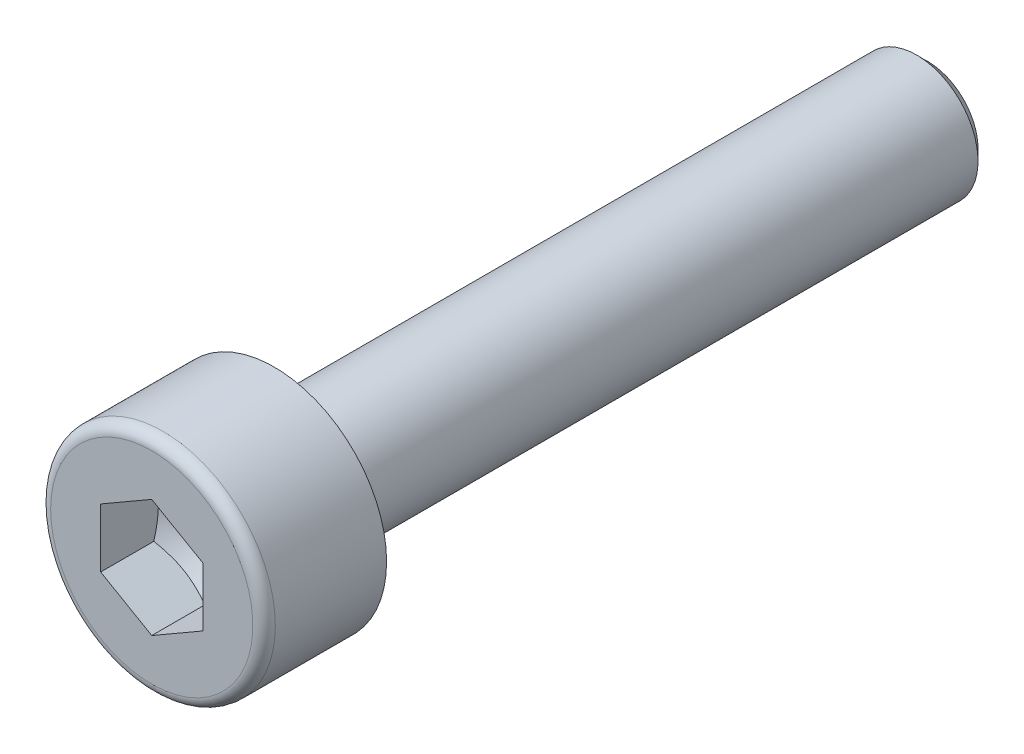
ISO-10303-21;
HEADER;
FILE_DESCRIPTION(('STEP AP214'),'2;1');
FILE_NAME('part.step','',(''),(''),'','','');
FILE_SCHEMA(('AUTOMOTIVE_DESIGN { 1 0 10303 214 1 1 1 1 }'));
ENDSEC;
DATA;
#1=APPLICATION_CONTEXT('core data for automotive mechanical design processes');
#2=APPLICATION_PROTOCOL_DEFINITION('international standard','automotive_design',2000,#1);
#3=PRODUCT_CONTEXT('',#1,'mechanical');
#4=PRODUCT('Part','Part','',(#3));
#5=PRODUCT_RELATED_PRODUCT_CATEGORY('part','',(#4));
#6=PRODUCT_DEFINITION_FORMATION('','',#4);
#7=PRODUCT_DEFINITION_CONTEXT('part definition',#1,'design');
#8=PRODUCT_DEFINITION('design','',#6,#7);
#9=PRODUCT_DEFINITION_SHAPE('','',#8);
#10=(LENGTH_UNIT() NAMED_UNIT(*) SI_UNIT(.MILLI.,.METRE.));
#11=(NAMED_UNIT(*) PLANE_ANGLE_UNIT() SI_UNIT($,.RADIAN.));
#12=(NAMED_UNIT(*) SI_UNIT($,.STERADIAN.) SOLID_ANGLE_UNIT());
#13=UNCERTAINTY_MEASURE_WITH_UNIT(LENGTH_MEASURE(1.E-05),#10,'distance_accuracy_value','');
#14=(GEOMETRIC_REPRESENTATION_CONTEXT(3) GLOBAL_UNCERTAINTY_ASSIGNED_CONTEXT((#13)) GLOBAL_UNIT_ASSIGNED_CONTEXT((#10,
#11,#12)) REPRESENTATION_CONTEXT('',''));
#15=CARTESIAN_POINT('',(0.,0.,0.));
#16=DIRECTION('',(0.,0.,1.));
#17=DIRECTION('',(1.,0.,0.));
#18=AXIS2_PLACEMENT_3D('',#15,#16,#17);
#19=CARTESIAN_POINT('',(-1.375,0.,0.));
#20=DIRECTION('',(0.,0.,-1.));
#21=DIRECTION('',(-1.,0.,0.));
#22=AXIS2_PLACEMENT_3D('',#19,#20,#21);
#23=PLANE('',#22);
#24=CARTESIAN_POINT('',(0.,0.,0.));
#25=DIRECTION('',(0.,0.,-1.));
#26=DIRECTION('',(-1.,0.,0.));
#27=AXIS2_PLACEMENT_3D('',#24,#25,#26);
#28=CIRCLE('',#27,2.75);
#29=CARTESIAN_POINT('',(-2.75,0.,0.));
#30=VERTEX_POINT('',#29);
#31=EDGE_CURVE('E10',#30,#30,#28,.T.);
#32=ORIENTED_EDGE('',*,*,#31,.T.);
#33=EDGE_LOOP('',(#32));
#34=FACE_BOUND('',#33,.T.);
#35=CARTESIAN_POINT('',(0.,0.,0.));
#36=DIRECTION('',(0.,0.,1.));
#37=DIRECTION('',(-1.,0.,0.));
#38=AXIS2_PLACEMENT_3D('',#35,#36,#37);
#39=CIRCLE('',#38,1.5);
#40=CARTESIAN_POINT('',(1.5,0.,0.));
#41=VERTEX_POINT('',#40);
#42=EDGE_CURVE('E125',#41,#41,#39,.T.);
#43=ORIENTED_EDGE('',*,*,#42,.T.);
#44=EDGE_LOOP('',(#43));
#45=FACE_BOUND('',#44,.T.);
#46=ADVANCED_FACE('F15',(#34,#45),#23,.T.);
#47=CARTESIAN_POINT('',(0.,0.,1.3625));
#48=DIRECTION('',(0.,0.,1.));
#49=DIRECTION('',(-1.,0.,0.));
#50=AXIS2_PLACEMENT_3D('',#47,#48,#49);
#51=CYLINDRICAL_SURFACE('',#50,2.75);
#52=CARTESIAN_POINT('',(0.,0.,2.725));
#53=DIRECTION('',(0.,0.,-1.));
#54=DIRECTION('',(-1.,0.,0.));
#55=AXIS2_PLACEMENT_3D('',#52,#53,#54);
#56=CIRCLE('',#55,2.75);
#57=CARTESIAN_POINT('',(-2.75,0.,2.725));
#58=VERTEX_POINT('',#57);
#59=EDGE_CURVE('E24',#58,#58,#56,.T.);
#60=ORIENTED_EDGE('',*,*,#59,.T.);
#61=EDGE_LOOP('',(#60));
#62=FACE_BOUND('',#61,.T.);
#63=ORIENTED_EDGE('',*,*,#31,.F.);
#64=EDGE_LOOP('',(#63));
#65=FACE_BOUND('',#64,.T.);
#66=ADVANCED_FACE('F181',(#62,#65),#51,.T.);
#67=CARTESIAN_POINT('',(0.,0.,2.725));
#68=DIRECTION('',(0.,0.,-1.));
#69=DIRECTION('',(0.,-1.,0.));
#70=AXIS2_PLACEMENT_3D('',#67,#68,#69);
#71=TOROIDAL_SURFACE('',#70,2.475,0.275);
#72=CARTESIAN_POINT('',(0.,0.,3.));
#73=DIRECTION('',(0.,0.,-1.));
#74=DIRECTION('',(-1.,0.,0.));
#75=AXIS2_PLACEMENT_3D('',#72,#73,#74);
#76=CIRCLE('',#75,2.475);
#77=CARTESIAN_POINT('',(-2.475,0.,3.));
#78=VERTEX_POINT('',#77);
#79=EDGE_CURVE('E130',#78,#78,#76,.T.);
#80=ORIENTED_EDGE('',*,*,#79,.T.);
#81=EDGE_LOOP('',(#80));
#82=FACE_BOUND('',#81,.T.);
#83=ORIENTED_EDGE('',*,*,#59,.F.);
#84=EDGE_LOOP('',(#83));
#85=FACE_BOUND('',#84,.T.);
#86=ADVANCED_FACE('F184',(#82,#85),#71,.T.);
#87=CARTESIAN_POINT('',(-1.2375,0.,3.));
#88=DIRECTION('',(0.,0.,1.));
#89=DIRECTION('',(1.,0.,0.));
#90=AXIS2_PLACEMENT_3D('',#87,#88,#89);
#91=PLANE('',#90);
#92=ORIENTED_EDGE('',*,*,#79,.F.);
#93=EDGE_LOOP('',(#92));
#94=FACE_BOUND('',#93,.T.);
#95=DIRECTION('',(-0.866025403784439,-0.5,0.));
#96=VECTOR('',#95,1.);
#97=CARTESIAN_POINT('',(0.160937208593682,-1.35045785929581,3.));
#98=LINE('',#97,#96);
#99=CARTESIAN_POINT('',(1.24999941718736,-0.7216875,3.));
#100=VERTEX_POINT('',#99);
#101=CARTESIAN_POINT('',(0.,-1.443375,3.));
#102=VERTEX_POINT('',#101);
#103=EDGE_CURVE('E116',#100,#102,#98,.T.);
#104=ORIENTED_EDGE('',*,*,#103,.T.);
#105=DIRECTION('',(-0.866025403784439,0.5,0.));
#106=VECTOR('',#105,1.);
#107=CARTESIAN_POINT('',(-1.08906220859368,-0.81460464070419,3.));
#108=LINE('',#107,#106);
#109=CARTESIAN_POINT('',(-1.24999941718736,-0.7216875,3.));
#110=VERTEX_POINT('',#109);
#111=EDGE_CURVE('E133',#102,#110,#108,.T.);
#112=ORIENTED_EDGE('',*,*,#111,.T.);
#113=DIRECTION('',(0.,1.,0.));
#114=VECTOR('',#113,1.);
#115=CARTESIAN_POINT('',(-1.24999941718736,0.,3.));
#116=LINE('',#115,#114);
#117=CARTESIAN_POINT('',(-1.24999941718736,0.7216875,3.));
#118=VERTEX_POINT('',#117);
#119=EDGE_CURVE('E18',#110,#118,#116,.T.);
#120=ORIENTED_EDGE('',*,*,#119,.T.);
#121=DIRECTION('',(0.866025403784439,0.5,0.));
#122=VECTOR('',#121,1.);
#123=CARTESIAN_POINT('',(-1.08906220859368,0.81460464070419,3.));
#124=LINE('',#123,#122);
#125=CARTESIAN_POINT('',(0.,1.443375,3.));
#126=VERTEX_POINT('',#125);
#127=EDGE_CURVE('E82',#118,#126,#124,.T.);
#128=ORIENTED_EDGE('',*,*,#127,.T.);
#129=DIRECTION('',(0.866025403784439,-0.5,0.));
#130=VECTOR('',#129,1.);
#131=CARTESIAN_POINT('',(0.160937208593682,1.35045785929581,3.));
#132=LINE('',#131,#130);
#133=CARTESIAN_POINT('',(1.24999941718736,0.7216875,3.));
#134=VERTEX_POINT('',#133);
#135=EDGE_CURVE('E147',#126,#134,#132,.T.);
#136=ORIENTED_EDGE('',*,*,#135,.T.);
#137=DIRECTION('',(0.,-1.,0.));
#138=VECTOR('',#137,1.);
#139=CARTESIAN_POINT('',(1.24999941718736,0.,3.));
#140=LINE('',#139,#138);
#141=EDGE_CURVE('E124',#134,#100,#140,.T.);
#142=ORIENTED_EDGE('',*,*,#141,.T.);
#143=EDGE_LOOP('',(#104,#112,#120,#128,#136,#142));
#144=FACE_BOUND('',#143,.T.);
#145=ADVANCED_FACE('F186',(#94,#144),#91,.T.);
#146=CARTESIAN_POINT('',(-0.6146875,0.,-16.));
#147=DIRECTION('',(0.,0.,-1.));
#148=DIRECTION('',(-1.,0.,0.));
#149=AXIS2_PLACEMENT_3D('',#146,#147,#148);
#150=PLANE('',#149);
#151=CARTESIAN_POINT('',(0.,0.,-16.));
#152=DIRECTION('',(0.,0.,-1.));
#153=DIRECTION('',(-1.,0.,0.));
#154=AXIS2_PLACEMENT_3D('',#151,#152,#153);
#155=CIRCLE('',#154,1.229375);
#156=CARTESIAN_POINT('',(-1.229375,0.,-16.));
#157=VERTEX_POINT('',#156);
#158=EDGE_CURVE('E126',#157,#157,#155,.T.);
#159=ORIENTED_EDGE('',*,*,#158,.T.);
#160=EDGE_LOOP('',(#159));
#161=FACE_BOUND('',#160,.T.);
#162=ADVANCED_FACE('F194',(#161),#150,.T.);
#163=CARTESIAN_POINT('',(0.,0.,-15.8646875));
#164=DIRECTION('',(0.,0.,1.));
#165=DIRECTION('',(-1.,0.,0.));
#166=AXIS2_PLACEMENT_3D('',#163,#164,#165);
#167=CONICAL_SURFACE('',#166,1.3646875,0.78539816339745);
#168=CARTESIAN_POINT('',(0.,0.,-15.729375));
#169=DIRECTION('',(0.,0.,-1.));
#170=DIRECTION('',(-1.,0.,0.));
#171=AXIS2_PLACEMENT_3D('',#168,#169,#170);
#172=CIRCLE('',#171,1.5);
#173=CARTESIAN_POINT('',(-1.5,0.,-15.729375));
#174=VERTEX_POINT('',#173);
#175=EDGE_CURVE('E127',#174,#174,#172,.T.);
#176=ORIENTED_EDGE('',*,*,#175,.T.);
#177=EDGE_LOOP('',(#176));
#178=FACE_BOUND('',#177,.T.);
#179=ORIENTED_EDGE('',*,*,#158,.F.);
#180=EDGE_LOOP('',(#179));
#181=FACE_BOUND('',#180,.T.);
#182=ADVANCED_FACE('F231',(#178,#181),#167,.T.);
#183=CARTESIAN_POINT('',(0.,0.,-7.3646875));
#184=DIRECTION('',(0.,0.,1.));
#185=DIRECTION('',(-1.,0.,0.));
#186=AXIS2_PLACEMENT_3D('',#183,#184,#185);
#187=CYLINDRICAL_SURFACE('',#186,1.5);
#188=ORIENTED_EDGE('',*,*,#42,.F.);
#189=EDGE_LOOP('',(#188));
#190=FACE_BOUND('',#189,.T.);
#191=ORIENTED_EDGE('',*,*,#175,.F.);
#192=EDGE_LOOP('',(#191));
#193=FACE_BOUND('',#192,.T.);
#194=ADVANCED_FACE('F240',(#190,#193),#187,.T.);
#195=CARTESIAN_POINT('',(-0.624999708593682,-1.08253125,3.));
#196=DIRECTION('',(-0.5,-0.866025403784439,0.));
#197=DIRECTION('',(-0.866025403784439,0.5,0.));
#198=AXIS2_PLACEMENT_3D('',#195,#196,#197);
#199=PLANE('',#198);
#200=CARTESIAN_POINT('',(0.,-1.443375,1.7));
#201=CARTESIAN_POINT('',(-0.62499970859368,-1.08253125,1.49166676380211));
#202=CARTESIAN_POINT('',(-1.24999941718736,-0.7216875,1.7));
#203=(BOUNDED_CURVE() B_SPLINE_CURVE(2,(#200,#201,#202),.UNSPECIFIED.,.F.,
.F.) B_SPLINE_CURVE_WITH_KNOTS((3,3),(0.,1.46054449161806),
.UNSPECIFIED.) CURVE() GEOMETRIC_REPRESENTATION_ITEM() RATIONAL_B_SPLINE_CURVE((1.,
1.15470053837926,1.)) REPRESENTATION_ITEM(''));
#204=CARTESIAN_POINT('',(0.,-1.443375,1.7));
#205=VERTEX_POINT('',#204);
#206=CARTESIAN_POINT('',(-1.24999941718736,-0.7216875,1.7));
#207=VERTEX_POINT('',#206);
#208=EDGE_CURVE('E94',#205,#207,#203,.T.);
#209=ORIENTED_EDGE('',*,*,#208,.T.);
#210=DIRECTION('',(0.,0.,-1.));
#211=VECTOR('',#210,1.);
#212=CARTESIAN_POINT('',(-1.24999941718736,-0.7216875,3.));
#213=LINE('',#212,#211);
#214=EDGE_CURVE('E90',#110,#207,#213,.T.);
#215=ORIENTED_EDGE('',*,*,#214,.F.);
#216=ORIENTED_EDGE('',*,*,#111,.F.);
#217=DIRECTION('',(0.,0.,-1.));
#218=VECTOR('',#217,1.);
#219=CARTESIAN_POINT('',(0.,-1.443375,3.));
#220=LINE('',#219,#218);
#221=EDGE_CURVE('E123',#102,#205,#220,.T.);
#222=ORIENTED_EDGE('',*,*,#221,.T.);
#223=EDGE_LOOP('',(#209,#215,#216,#222));
#224=FACE_BOUND('',#223,.T.);
#225=ADVANCED_FACE('F250',(#224),#199,.F.);
#226=CARTESIAN_POINT('',(-1.24999941718736,0.,3.));
#227=DIRECTION('',(-1.,0.,0.));
#228=DIRECTION('',(0.,1.,0.));
#229=AXIS2_PLACEMENT_3D('',#226,#227,#228);
#230=PLANE('',#229);
#231=CARTESIAN_POINT('',(-1.24999941718736,-0.7216875,1.7));
#232=CARTESIAN_POINT('',(-1.24999941718737,0.,1.4916667638021));
#233=CARTESIAN_POINT('',(-1.24999941718736,0.7216875,1.7));
#234=(BOUNDED_CURVE() B_SPLINE_CURVE(2,(#231,#232,#233),.UNSPECIFIED.,.F.,
.F.) B_SPLINE_CURVE_WITH_KNOTS((3,3),(0.,1.46054449161806),
.UNSPECIFIED.) CURVE() GEOMETRIC_REPRESENTATION_ITEM() RATIONAL_B_SPLINE_CURVE((1.,
1.15470053837925,1.)) REPRESENTATION_ITEM(''));
#235=CARTESIAN_POINT('',(-1.24999941718736,0.7216875,1.7));
#236=VERTEX_POINT('',#235);
#237=EDGE_CURVE('E87',#207,#236,#234,.T.);
#238=ORIENTED_EDGE('',*,*,#237,.T.);
#239=DIRECTION('',(0.,0.,-1.));
#240=VECTOR('',#239,1.);
#241=CARTESIAN_POINT('',(-1.24999941718736,0.7216875,3.));
#242=LINE('',#241,#240);
#243=EDGE_CURVE('E75',#118,#236,#242,.T.);
#244=ORIENTED_EDGE('',*,*,#243,.F.);
#245=ORIENTED_EDGE('',*,*,#119,.F.);
#246=ORIENTED_EDGE('',*,*,#214,.T.);
#247=EDGE_LOOP('',(#238,#244,#245,#246));
#248=FACE_BOUND('',#247,.T.);
#249=ADVANCED_FACE('F88',(#248),#230,.F.);
#250=CARTESIAN_POINT('',(-0.624999708593682,1.08253125,3.));
#251=DIRECTION('',(-0.5,0.866025403784439,0.));
#252=DIRECTION('',(0.866025403784439,0.5,0.));
#253=AXIS2_PLACEMENT_3D('',#250,#251,#252);
#254=PLANE('',#253);
#255=CARTESIAN_POINT('',(-1.24999941718737,0.7216875,1.7));
#256=CARTESIAN_POINT('',(-0.624999708593683,1.08253125,1.49166676380211));
#257=CARTESIAN_POINT('',(0.,1.443375,1.7));
#258=(BOUNDED_CURVE() B_SPLINE_CURVE(2,(#255,#256,#257),.UNSPECIFIED.,.F.,
.F.) B_SPLINE_CURVE_WITH_KNOTS((3,3),(0.,1.46054449161806),
.UNSPECIFIED.) CURVE() GEOMETRIC_REPRESENTATION_ITEM() RATIONAL_B_SPLINE_CURVE((1.,
1.15470053837925,1.)) REPRESENTATION_ITEM(''));
#259=CARTESIAN_POINT('',(0.,1.443375,1.7));
#260=VERTEX_POINT('',#259);
#261=EDGE_CURVE('E80',#236,#260,#258,.T.);
#262=ORIENTED_EDGE('',*,*,#261,.T.);
#263=DIRECTION('',(0.,0.,-1.));
#264=VECTOR('',#263,1.);
#265=CARTESIAN_POINT('',(0.,1.443375,3.));
#266=LINE('',#265,#264);
#267=EDGE_CURVE('E146',#126,#260,#266,.T.);
#268=ORIENTED_EDGE('',*,*,#267,.F.);
#269=ORIENTED_EDGE('',*,*,#127,.F.);
#270=ORIENTED_EDGE('',*,*,#243,.T.);
#271=EDGE_LOOP('',(#262,#268,#269,#270));
#272=FACE_BOUND('',#271,.T.);
#273=ADVANCED_FACE('F77',(#272),#254,.F.);
#274=CARTESIAN_POINT('',(0.624999708593682,1.08253125,3.));
#275=DIRECTION('',(0.5,0.866025403784439,0.));
#276=DIRECTION('',(0.866025403784439,-0.5,0.));
#277=AXIS2_PLACEMENT_3D('',#274,#275,#276);
#278=PLANE('',#277);
#279=CARTESIAN_POINT('',(0.,1.443375,1.7));
#280=CARTESIAN_POINT('',(0.624999708593683,1.08253125,1.49166676380211));
#281=CARTESIAN_POINT('',(1.24999941718737,0.7216875,1.7));
#282=(BOUNDED_CURVE() B_SPLINE_CURVE(2,(#279,#280,#281),.UNSPECIFIED.,.F.,
.F.) B_SPLINE_CURVE_WITH_KNOTS((3,3),(0.,1.46054449161806),
.UNSPECIFIED.) CURVE() GEOMETRIC_REPRESENTATION_ITEM() RATIONAL_B_SPLINE_CURVE((1.,
1.15470053837925,1.)) REPRESENTATION_ITEM(''));
#283=CARTESIAN_POINT('',(1.24999941718736,0.7216875,1.7));
#284=VERTEX_POINT('',#283);
#285=EDGE_CURVE('E100',#260,#284,#282,.T.);
#286=ORIENTED_EDGE('',*,*,#285,.T.);
#287=DIRECTION('',(0.,0.,-1.));
#288=VECTOR('',#287,1.);
#289=CARTESIAN_POINT('',(1.24999941718736,0.7216875,3.));
#290=LINE('',#289,#288);
#291=EDGE_CURVE('E106',#134,#284,#290,.T.);
#292=ORIENTED_EDGE('',*,*,#291,.F.);
#293=ORIENTED_EDGE('',*,*,#135,.F.);
#294=ORIENTED_EDGE('',*,*,#267,.T.);
#295=EDGE_LOOP('',(#286,#292,#293,#294));
#296=FACE_BOUND('',#295,.T.);
#297=ADVANCED_FACE('F278',(#296),#278,.F.);
#298=CARTESIAN_POINT('',(1.24999941718736,0.,3.));
#299=DIRECTION('',(1.,0.,0.));
#300=DIRECTION('',(0.,-1.,0.));
#301=AXIS2_PLACEMENT_3D('',#298,#299,#300);
#302=PLANE('',#301);
#303=CARTESIAN_POINT('',(1.24999941718736,0.7216875,1.7));
#304=CARTESIAN_POINT('',(1.24999941718736,0.,1.4916667638021));
#305=CARTESIAN_POINT('',(1.24999941718736,-0.7216875,1.7));
#306=(BOUNDED_CURVE() B_SPLINE_CURVE(2,(#303,#304,#305),.UNSPECIFIED.,.F.,
.F.) B_SPLINE_CURVE_WITH_KNOTS((3,3),(0.,1.46054449161806),
.UNSPECIFIED.) CURVE() GEOMETRIC_REPRESENTATION_ITEM() RATIONAL_B_SPLINE_CURVE((1.,
1.15470053837925,1.)) REPRESENTATION_ITEM(''));
#307=CARTESIAN_POINT('',(1.24999941718736,-0.7216875,1.7));
#308=VERTEX_POINT('',#307);
#309=EDGE_CURVE('E115',#284,#308,#306,.T.);
#310=ORIENTED_EDGE('',*,*,#309,.T.);
#311=DIRECTION('',(0.,0.,-1.));
#312=VECTOR('',#311,1.);
#313=CARTESIAN_POINT('',(1.24999941718736,-0.7216875,3.));
#314=LINE('',#313,#312);
#315=EDGE_CURVE('E122',#100,#308,#314,.T.);
#316=ORIENTED_EDGE('',*,*,#315,.F.);
#317=ORIENTED_EDGE('',*,*,#141,.F.);
#318=ORIENTED_EDGE('',*,*,#291,.T.);
#319=EDGE_LOOP('',(#310,#316,#317,#318));
#320=FACE_BOUND('',#319,.T.);
#321=ADVANCED_FACE('F287',(#320),#302,.F.);
#322=CARTESIAN_POINT('',(0.624999708593682,-1.08253125,3.));
#323=DIRECTION('',(0.5,-0.866025403784439,0.));
#324=DIRECTION('',(-0.866025403784439,-0.5,0.));
#325=AXIS2_PLACEMENT_3D('',#322,#323,#324);
#326=PLANE('',#325);
#327=CARTESIAN_POINT('',(1.24999941718737,-0.7216875,1.7));
#328=CARTESIAN_POINT('',(0.624999708593682,-1.08253125,1.4916667638021));
#329=CARTESIAN_POINT('',(0.,-1.443375,1.7));
#330=(BOUNDED_CURVE() B_SPLINE_CURVE(2,(#327,#328,#329),.UNSPECIFIED.,.F.,
.F.) B_SPLINE_CURVE_WITH_KNOTS((3,3),(0.,1.46054449161806),
.UNSPECIFIED.) CURVE() GEOMETRIC_REPRESENTATION_ITEM() RATIONAL_B_SPLINE_CURVE((1.,
1.15470053837925,1.)) REPRESENTATION_ITEM(''));
#331=EDGE_CURVE('E107',#308,#205,#330,.T.);
#332=ORIENTED_EDGE('',*,*,#331,.T.);
#333=ORIENTED_EDGE('',*,*,#221,.F.);
#334=ORIENTED_EDGE('',*,*,#103,.F.);
#335=ORIENTED_EDGE('',*,*,#315,.T.);
#336=EDGE_LOOP('',(#332,#333,#334,#335));
#337=FACE_BOUND('',#336,.T.);
#338=ADVANCED_FACE('F296',(#337),#326,.F.);
#339=CARTESIAN_POINT('',(0.,0.,1.28333352760421));
#340=DIRECTION('',(0.,0.,1.));
#341=DIRECTION('',(-1.,0.,0.));
#342=AXIS2_PLACEMENT_3D('',#339,#340,#341);
#343=CONICAL_SURFACE('',#342,0.7216875,1.0471975511966);
#344=CARTESIAN_POINT('',(0.,0.,0.866667055208424));
#345=VERTEX_POINT('',#344);
#346=VERTEX_LOOP('',#345);
#347=FACE_BOUND('',#346,.T.);
#348=ORIENTED_EDGE('',*,*,#261,.F.);
#349=ORIENTED_EDGE('',*,*,#237,.F.);
#350=ORIENTED_EDGE('',*,*,#208,.F.);
#351=ORIENTED_EDGE('',*,*,#331,.F.);
#352=ORIENTED_EDGE('',*,*,#309,.F.);
#353=ORIENTED_EDGE('',*,*,#285,.F.);
#354=EDGE_LOOP('',(#348,#349,#350,#351,#352,#353));
#355=FACE_BOUND('',#354,.T.);
#356=ADVANCED_FACE('F97',(#347,#355),#343,.F.);
#357=CLOSED_SHELL('',(#46,#66,#86,#145,#162,#182,#194,#225,#249,#273,#297,#321,#338,#356));
#358=MANIFOLD_SOLID_BREP('B1',#357);
#359=ADVANCED_BREP_SHAPE_REPRESENTATION('',(#18,#358),#14);
#360=SHAPE_DEFINITION_REPRESENTATION(#9,#359);
ENDSEC;
END-ISO-10303-21;
